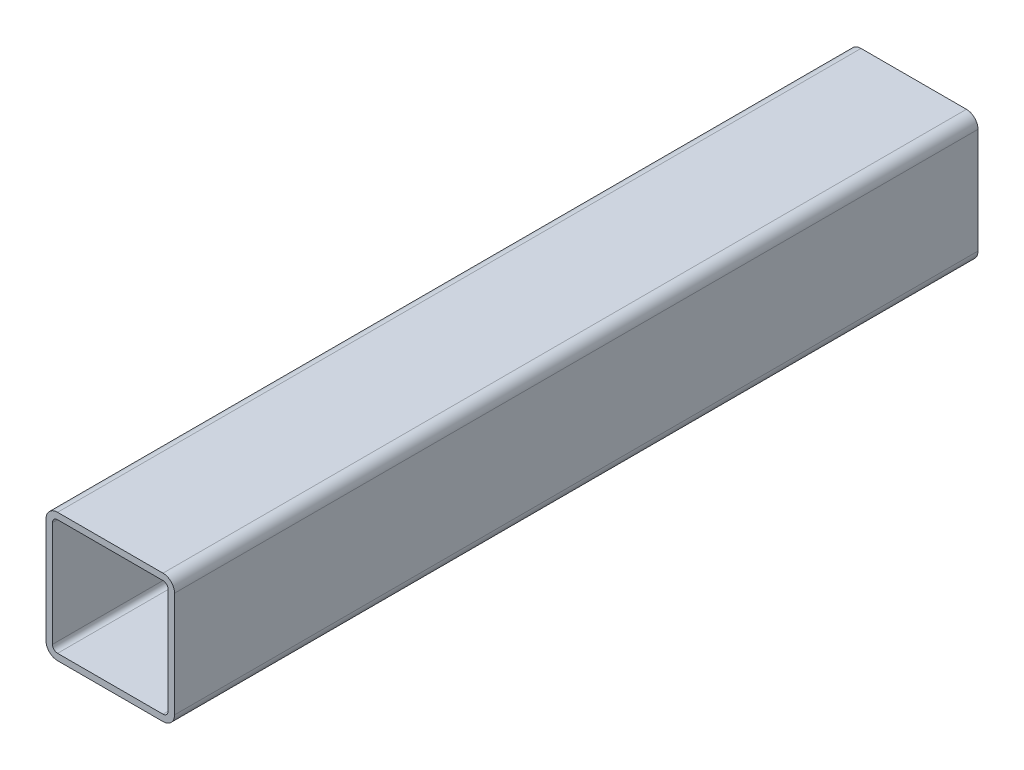
ISO-10303-21;
HEADER;
FILE_DESCRIPTION(('STEP AP214'),'2;1');
FILE_NAME('part.step','',(''),(''),'','','');
FILE_SCHEMA(('AUTOMOTIVE_DESIGN { 1 0 10303 214 1 1 1 1 }'));
ENDSEC;
DATA;
#1=APPLICATION_CONTEXT('core data for automotive mechanical design processes');
#2=APPLICATION_PROTOCOL_DEFINITION('international standard','automotive_design',2000,#1);
#3=PRODUCT_CONTEXT('',#1,'mechanical');
#4=PRODUCT('Part','Part','',(#3));
#5=PRODUCT_RELATED_PRODUCT_CATEGORY('part','',(#4));
#6=PRODUCT_DEFINITION_FORMATION('','',#4);
#7=PRODUCT_DEFINITION_CONTEXT('part definition',#1,'design');
#8=PRODUCT_DEFINITION('design','',#6,#7);
#9=PRODUCT_DEFINITION_SHAPE('','',#8);
#10=(LENGTH_UNIT() NAMED_UNIT(*) SI_UNIT(.MILLI.,.METRE.));
#11=(NAMED_UNIT(*) PLANE_ANGLE_UNIT() SI_UNIT($,.RADIAN.));
#12=(NAMED_UNIT(*) SI_UNIT($,.STERADIAN.) SOLID_ANGLE_UNIT());
#13=UNCERTAINTY_MEASURE_WITH_UNIT(LENGTH_MEASURE(1.E-05),#10,'distance_accuracy_value','');
#14=(GEOMETRIC_REPRESENTATION_CONTEXT(3) GLOBAL_UNCERTAINTY_ASSIGNED_CONTEXT((#13)) GLOBAL_UNIT_ASSIGNED_CONTEXT((#10,
#11,#12)) REPRESENTATION_CONTEXT('',''));
#15=CARTESIAN_POINT('',(0.,0.,0.));
#16=DIRECTION('',(0.,0.,1.));
#17=DIRECTION('',(1.,0.,0.));
#18=AXIS2_PLACEMENT_3D('',#15,#16,#17);
#19=CARTESIAN_POINT('',(32.8,32.8,500.));
#20=DIRECTION('',(0.,0.,1.));
#21=DIRECTION('',(1.,0.,0.));
#22=AXIS2_PLACEMENT_3D('',#19,#20,#21);
#23=PLANE('',#22);
#24=CARTESIAN_POINT('',(32.8,32.8,500.));
#25=DIRECTION('',(0.,0.,1.));
#26=DIRECTION('',(1.,0.,0.));
#27=AXIS2_PLACEMENT_3D('',#24,#25,#26);
#28=CIRCLE('',#27,7.20000000000001);
#29=CARTESIAN_POINT('',(40.,32.8,500.));
#30=VERTEX_POINT('',#29);
#31=CARTESIAN_POINT('',(32.8,40.,500.));
#32=VERTEX_POINT('',#31);
#33=EDGE_CURVE('E219',#30,#32,#28,.T.);
#34=ORIENTED_EDGE('',*,*,#33,.T.);
#35=DIRECTION('',(-1.,0.,0.));
#36=VECTOR('',#35,1.);
#37=CARTESIAN_POINT('',(32.8,40.,500.));
#38=LINE('',#37,#36);
#39=CARTESIAN_POINT('',(-32.8,40.,500.));
#40=VERTEX_POINT('',#39);
#41=EDGE_CURVE('E222',#32,#40,#38,.T.);
#42=ORIENTED_EDGE('',*,*,#41,.T.);
#43=CARTESIAN_POINT('',(-32.8,32.8,500.));
#44=DIRECTION('',(0.,0.,1.));
#45=DIRECTION('',(1.,0.,0.));
#46=AXIS2_PLACEMENT_3D('',#43,#44,#45);
#47=CIRCLE('',#46,7.20000000000001);
#48=CARTESIAN_POINT('',(-40.,32.8,500.));
#49=VERTEX_POINT('',#48);
#50=EDGE_CURVE('E225',#40,#49,#47,.T.);
#51=ORIENTED_EDGE('',*,*,#50,.T.);
#52=DIRECTION('',(0.,-1.,0.));
#53=VECTOR('',#52,1.);
#54=CARTESIAN_POINT('',(-40.,-32.8,500.));
#55=LINE('',#54,#53);
#56=CARTESIAN_POINT('',(-40.,-32.8,500.));
#57=VERTEX_POINT('',#56);
#58=EDGE_CURVE('E227',#49,#57,#55,.T.);
#59=ORIENTED_EDGE('',*,*,#58,.T.);
#60=CARTESIAN_POINT('',(-32.8,-32.8,500.));
#61=DIRECTION('',(0.,0.,1.));
#62=DIRECTION('',(1.,0.,0.));
#63=AXIS2_PLACEMENT_3D('',#60,#61,#62);
#64=CIRCLE('',#63,7.2);
#65=CARTESIAN_POINT('',(-32.8,-40.,500.));
#66=VERTEX_POINT('',#65);
#67=EDGE_CURVE('E229',#57,#66,#64,.T.);
#68=ORIENTED_EDGE('',*,*,#67,.T.);
#69=DIRECTION('',(1.,0.,0.));
#70=VECTOR('',#69,1.);
#71=CARTESIAN_POINT('',(-32.8,-40.,500.));
#72=LINE('',#71,#70);
#73=CARTESIAN_POINT('',(32.8,-40.,500.));
#74=VERTEX_POINT('',#73);
#75=EDGE_CURVE('E231',#66,#74,#72,.T.);
#76=ORIENTED_EDGE('',*,*,#75,.T.);
#77=CARTESIAN_POINT('',(32.8,-32.8,500.));
#78=DIRECTION('',(0.,0.,1.));
#79=DIRECTION('',(1.,0.,0.));
#80=AXIS2_PLACEMENT_3D('',#77,#78,#79);
#81=CIRCLE('',#80,7.20000000000001);
#82=CARTESIAN_POINT('',(40.,-32.8,500.));
#83=VERTEX_POINT('',#82);
#84=EDGE_CURVE('E233',#74,#83,#81,.T.);
#85=ORIENTED_EDGE('',*,*,#84,.T.);
#86=DIRECTION('',(0.,1.,0.));
#87=VECTOR('',#86,1.);
#88=CARTESIAN_POINT('',(40.,32.8,500.));
#89=LINE('',#88,#87);
#90=EDGE_CURVE('E235',#83,#30,#89,.T.);
#91=ORIENTED_EDGE('',*,*,#90,.T.);
#92=EDGE_LOOP('',(#34,#42,#51,#59,#68,#76,#85,#91));
#93=FACE_BOUND('',#92,.T.);
#94=DIRECTION('',(0.,-1.,0.));
#95=VECTOR('',#94,1.);
#96=CARTESIAN_POINT('',(-36.,-32.8,500.));
#97=LINE('',#96,#95);
#98=CARTESIAN_POINT('',(-36.,32.8,500.));
#99=VERTEX_POINT('',#98);
#100=CARTESIAN_POINT('',(-36.,-32.8,500.));
#101=VERTEX_POINT('',#100);
#102=EDGE_CURVE('E162',#99,#101,#97,.T.);
#103=ORIENTED_EDGE('',*,*,#102,.F.);
#104=CARTESIAN_POINT('',(-32.8,32.8,500.));
#105=DIRECTION('',(0.,0.,1.));
#106=DIRECTION('',(1.,0.,0.));
#107=AXIS2_PLACEMENT_3D('',#104,#105,#106);
#108=CIRCLE('',#107,3.20000000000001);
#109=CARTESIAN_POINT('',(-32.8,36.,500.));
#110=VERTEX_POINT('',#109);
#111=EDGE_CURVE('E154',#110,#99,#108,.T.);
#112=ORIENTED_EDGE('',*,*,#111,.F.);
#113=DIRECTION('',(-1.,0.,0.));
#114=VECTOR('',#113,1.);
#115=CARTESIAN_POINT('',(32.8,36.,500.));
#116=LINE('',#115,#114);
#117=CARTESIAN_POINT('',(32.8,36.,500.));
#118=VERTEX_POINT('',#117);
#119=EDGE_CURVE('E187',#118,#110,#116,.T.);
#120=ORIENTED_EDGE('',*,*,#119,.F.);
#121=CARTESIAN_POINT('',(32.8,32.8,500.));
#122=DIRECTION('',(0.,0.,1.));
#123=DIRECTION('',(1.,0.,0.));
#124=AXIS2_PLACEMENT_3D('',#121,#122,#123);
#125=CIRCLE('',#124,3.20000000000001);
#126=CARTESIAN_POINT('',(36.,32.8,500.));
#127=VERTEX_POINT('',#126);
#128=EDGE_CURVE('E185',#127,#118,#125,.T.);
#129=ORIENTED_EDGE('',*,*,#128,.F.);
#130=DIRECTION('',(0.,1.,0.));
#131=VECTOR('',#130,1.);
#132=CARTESIAN_POINT('',(36.,32.8,500.));
#133=LINE('',#132,#131);
#134=CARTESIAN_POINT('',(36.,-32.8,500.));
#135=VERTEX_POINT('',#134);
#136=EDGE_CURVE('E183',#135,#127,#133,.T.);
#137=ORIENTED_EDGE('',*,*,#136,.F.);
#138=CARTESIAN_POINT('',(32.8,-32.8,500.));
#139=DIRECTION('',(0.,0.,1.));
#140=DIRECTION('',(1.,0.,0.));
#141=AXIS2_PLACEMENT_3D('',#138,#139,#140);
#142=CIRCLE('',#141,3.20000000000001);
#143=CARTESIAN_POINT('',(32.8,-36.,500.));
#144=VERTEX_POINT('',#143);
#145=EDGE_CURVE('E181',#144,#135,#142,.T.);
#146=ORIENTED_EDGE('',*,*,#145,.F.);
#147=DIRECTION('',(1.,0.,0.));
#148=VECTOR('',#147,1.);
#149=CARTESIAN_POINT('',(-32.8,-36.,500.));
#150=LINE('',#149,#148);
#151=CARTESIAN_POINT('',(-32.8,-36.,500.));
#152=VERTEX_POINT('',#151);
#153=EDGE_CURVE('E177',#152,#144,#150,.T.);
#154=ORIENTED_EDGE('',*,*,#153,.F.);
#155=CARTESIAN_POINT('',(-32.8,-32.8,500.));
#156=DIRECTION('',(0.,0.,1.));
#157=DIRECTION('',(1.,0.,0.));
#158=AXIS2_PLACEMENT_3D('',#155,#156,#157);
#159=CIRCLE('',#158,3.20000000000001);
#160=EDGE_CURVE('E175',#101,#152,#159,.T.);
#161=ORIENTED_EDGE('',*,*,#160,.F.);
#162=EDGE_LOOP('',(#103,#112,#120,#129,#137,#146,#154,#161));
#163=FACE_BOUND('',#162,.T.);
#164=ADVANCED_FACE('F41',(#93,#163),#23,.T.);
#165=CARTESIAN_POINT('',(32.8,32.8,0.));
#166=DIRECTION('',(0.,0.,1.));
#167=DIRECTION('',(1.,0.,0.));
#168=AXIS2_PLACEMENT_3D('',#165,#166,#167);
#169=PLANE('',#168);
#170=CARTESIAN_POINT('',(32.8,32.8,0.));
#171=DIRECTION('',(0.,0.,1.));
#172=DIRECTION('',(1.,0.,0.));
#173=AXIS2_PLACEMENT_3D('',#170,#171,#172);
#174=CIRCLE('',#173,7.20000000000001);
#175=CARTESIAN_POINT('',(40.,32.8,0.));
#176=VERTEX_POINT('',#175);
#177=CARTESIAN_POINT('',(32.8,40.,0.));
#178=VERTEX_POINT('',#177);
#179=EDGE_CURVE('E170',#176,#178,#174,.T.);
#180=ORIENTED_EDGE('',*,*,#179,.F.);
#181=DIRECTION('',(0.,1.,0.));
#182=VECTOR('',#181,1.);
#183=CARTESIAN_POINT('',(40.,32.8,0.));
#184=LINE('',#183,#182);
#185=CARTESIAN_POINT('',(40.,-32.8,0.));
#186=VERTEX_POINT('',#185);
#187=EDGE_CURVE('E223',#186,#176,#184,.T.);
#188=ORIENTED_EDGE('',*,*,#187,.F.);
#189=CARTESIAN_POINT('',(32.8,-32.8,0.));
#190=DIRECTION('',(0.,0.,1.));
#191=DIRECTION('',(1.,0.,0.));
#192=AXIS2_PLACEMENT_3D('',#189,#190,#191);
#193=CIRCLE('',#192,7.20000000000001);
#194=CARTESIAN_POINT('',(32.8,-40.,0.));
#195=VERTEX_POINT('',#194);
#196=EDGE_CURVE('E250',#195,#186,#193,.T.);
#197=ORIENTED_EDGE('',*,*,#196,.F.);
#198=DIRECTION('',(1.,0.,0.));
#199=VECTOR('',#198,1.);
#200=CARTESIAN_POINT('',(-32.8,-40.,0.));
#201=LINE('',#200,#199);
#202=CARTESIAN_POINT('',(-32.8,-40.,0.));
#203=VERTEX_POINT('',#202);
#204=EDGE_CURVE('E248',#203,#195,#201,.T.);
#205=ORIENTED_EDGE('',*,*,#204,.F.);
#206=CARTESIAN_POINT('',(-32.8,-32.8,0.));
#207=DIRECTION('',(0.,0.,1.));
#208=DIRECTION('',(1.,0.,0.));
#209=AXIS2_PLACEMENT_3D('',#206,#207,#208);
#210=CIRCLE('',#209,7.2);
#211=CARTESIAN_POINT('',(-40.,-32.8,0.));
#212=VERTEX_POINT('',#211);
#213=EDGE_CURVE('E246',#212,#203,#210,.T.);
#214=ORIENTED_EDGE('',*,*,#213,.F.);
#215=DIRECTION('',(0.,-1.,0.));
#216=VECTOR('',#215,1.);
#217=CARTESIAN_POINT('',(-40.,-32.8,0.));
#218=LINE('',#217,#216);
#219=CARTESIAN_POINT('',(-40.,32.8,0.));
#220=VERTEX_POINT('',#219);
#221=EDGE_CURVE('E244',#220,#212,#218,.T.);
#222=ORIENTED_EDGE('',*,*,#221,.F.);
#223=CARTESIAN_POINT('',(-32.8,32.8,0.));
#224=DIRECTION('',(0.,0.,1.));
#225=DIRECTION('',(1.,0.,0.));
#226=AXIS2_PLACEMENT_3D('',#223,#224,#225);
#227=CIRCLE('',#226,7.20000000000001);
#228=CARTESIAN_POINT('',(-32.8,40.,0.));
#229=VERTEX_POINT('',#228);
#230=EDGE_CURVE('E242',#229,#220,#227,.T.);
#231=ORIENTED_EDGE('',*,*,#230,.F.);
#232=DIRECTION('',(-1.,0.,0.));
#233=VECTOR('',#232,1.);
#234=CARTESIAN_POINT('',(32.8,40.,0.));
#235=LINE('',#234,#233);
#236=EDGE_CURVE('E240',#178,#229,#235,.T.);
#237=ORIENTED_EDGE('',*,*,#236,.F.);
#238=EDGE_LOOP('',(#180,#188,#197,#205,#214,#222,#231,#237));
#239=FACE_BOUND('',#238,.T.);
#240=CARTESIAN_POINT('',(-32.8,32.8,0.));
#241=DIRECTION('',(0.,0.,1.));
#242=DIRECTION('',(1.,0.,0.));
#243=AXIS2_PLACEMENT_3D('',#240,#241,#242);
#244=CIRCLE('',#243,3.20000000000001);
#245=CARTESIAN_POINT('',(-32.8,36.,0.));
#246=VERTEX_POINT('',#245);
#247=CARTESIAN_POINT('',(-36.,32.8,0.));
#248=VERTEX_POINT('',#247);
#249=EDGE_CURVE('E64',#246,#248,#244,.T.);
#250=ORIENTED_EDGE('',*,*,#249,.T.);
#251=DIRECTION('',(0.,-1.,0.));
#252=VECTOR('',#251,1.);
#253=CARTESIAN_POINT('',(-36.,-32.8,0.));
#254=LINE('',#253,#252);
#255=CARTESIAN_POINT('',(-36.,-32.8,0.));
#256=VERTEX_POINT('',#255);
#257=EDGE_CURVE('E169',#248,#256,#254,.T.);
#258=ORIENTED_EDGE('',*,*,#257,.T.);
#259=CARTESIAN_POINT('',(-32.8,-32.8,0.));
#260=DIRECTION('',(0.,0.,1.));
#261=DIRECTION('',(1.,0.,0.));
#262=AXIS2_PLACEMENT_3D('',#259,#260,#261);
#263=CIRCLE('',#262,3.20000000000001);
#264=CARTESIAN_POINT('',(-32.8,-36.,0.));
#265=VERTEX_POINT('',#264);
#266=EDGE_CURVE('E191',#256,#265,#263,.T.);
#267=ORIENTED_EDGE('',*,*,#266,.T.);
#268=DIRECTION('',(1.,0.,0.));
#269=VECTOR('',#268,1.);
#270=CARTESIAN_POINT('',(-32.8,-36.,0.));
#271=LINE('',#270,#269);
#272=CARTESIAN_POINT('',(32.8,-36.,0.));
#273=VERTEX_POINT('',#272);
#274=EDGE_CURVE('E194',#265,#273,#271,.T.);
#275=ORIENTED_EDGE('',*,*,#274,.T.);
#276=CARTESIAN_POINT('',(32.8,-32.8,0.));
#277=DIRECTION('',(0.,0.,1.));
#278=DIRECTION('',(1.,0.,0.));
#279=AXIS2_PLACEMENT_3D('',#276,#277,#278);
#280=CIRCLE('',#279,3.20000000000001);
#281=CARTESIAN_POINT('',(36.,-32.8,0.));
#282=VERTEX_POINT('',#281);
#283=EDGE_CURVE('E197',#273,#282,#280,.T.);
#284=ORIENTED_EDGE('',*,*,#283,.T.);
#285=DIRECTION('',(0.,1.,0.));
#286=VECTOR('',#285,1.);
#287=CARTESIAN_POINT('',(36.,32.8,0.));
#288=LINE('',#287,#286);
#289=CARTESIAN_POINT('',(36.,32.8,0.));
#290=VERTEX_POINT('',#289);
#291=EDGE_CURVE('E200',#282,#290,#288,.T.);
#292=ORIENTED_EDGE('',*,*,#291,.T.);
#293=CARTESIAN_POINT('',(32.8,32.8,0.));
#294=DIRECTION('',(0.,0.,1.));
#295=DIRECTION('',(1.,0.,0.));
#296=AXIS2_PLACEMENT_3D('',#293,#294,#295);
#297=CIRCLE('',#296,3.20000000000001);
#298=CARTESIAN_POINT('',(32.8,36.,0.));
#299=VERTEX_POINT('',#298);
#300=EDGE_CURVE('E203',#290,#299,#297,.T.);
#301=ORIENTED_EDGE('',*,*,#300,.T.);
#302=DIRECTION('',(-1.,0.,0.));
#303=VECTOR('',#302,1.);
#304=CARTESIAN_POINT('',(32.8,36.,0.));
#305=LINE('',#304,#303);
#306=EDGE_CURVE('E163',#299,#246,#305,.T.);
#307=ORIENTED_EDGE('',*,*,#306,.T.);
#308=EDGE_LOOP('',(#250,#258,#267,#275,#284,#292,#301,#307));
#309=FACE_BOUND('',#308,.T.);
#310=ADVANCED_FACE('F280',(#239,#309),#169,.F.);
#311=CARTESIAN_POINT('',(32.8,32.8,500.));
#312=DIRECTION('',(0.,0.,-1.));
#313=DIRECTION('',(-1.,0.,0.));
#314=AXIS2_PLACEMENT_3D('',#311,#312,#313);
#315=CYLINDRICAL_SURFACE('',#314,7.20000000000001);
#316=ORIENTED_EDGE('',*,*,#179,.T.);
#317=DIRECTION('',(0.,0.,-1.));
#318=VECTOR('',#317,1.);
#319=CARTESIAN_POINT('',(32.8,40.,500.));
#320=LINE('',#319,#318);
#321=EDGE_CURVE('E11',#32,#178,#320,.T.);
#322=ORIENTED_EDGE('',*,*,#321,.F.);
#323=ORIENTED_EDGE('',*,*,#33,.F.);
#324=DIRECTION('',(0.,0.,-1.));
#325=VECTOR('',#324,1.);
#326=CARTESIAN_POINT('',(40.,32.8,500.));
#327=LINE('',#326,#325);
#328=EDGE_CURVE('E237',#30,#176,#327,.T.);
#329=ORIENTED_EDGE('',*,*,#328,.T.);
#330=EDGE_LOOP('',(#316,#322,#323,#329));
#331=FACE_BOUND('',#330,.T.);
#332=ADVANCED_FACE('F43',(#331),#315,.T.);
#333=CARTESIAN_POINT('',(32.8,40.,500.));
#334=DIRECTION('',(0.,-1.,0.));
#335=DIRECTION('',(0.,0.,-1.));
#336=AXIS2_PLACEMENT_3D('',#333,#334,#335);
#337=PLANE('',#336);
#338=ORIENTED_EDGE('',*,*,#236,.T.);
#339=DIRECTION('',(0.,0.,-1.));
#340=VECTOR('',#339,1.);
#341=CARTESIAN_POINT('',(-32.8,40.,500.));
#342=LINE('',#341,#340);
#343=EDGE_CURVE('E49',#40,#229,#342,.T.);
#344=ORIENTED_EDGE('',*,*,#343,.F.);
#345=ORIENTED_EDGE('',*,*,#41,.F.);
#346=ORIENTED_EDGE('',*,*,#321,.T.);
#347=EDGE_LOOP('',(#338,#344,#345,#346));
#348=FACE_BOUND('',#347,.T.);
#349=ADVANCED_FACE('F297',(#348),#337,.F.);
#350=CARTESIAN_POINT('',(-32.8,32.8,500.));
#351=DIRECTION('',(0.,0.,-1.));
#352=DIRECTION('',(-1.,0.,0.));
#353=AXIS2_PLACEMENT_3D('',#350,#351,#352);
#354=CYLINDRICAL_SURFACE('',#353,7.20000000000001);
#355=ORIENTED_EDGE('',*,*,#230,.T.);
#356=DIRECTION('',(0.,0.,-1.));
#357=VECTOR('',#356,1.);
#358=CARTESIAN_POINT('',(-40.,32.8,500.));
#359=LINE('',#358,#357);
#360=EDGE_CURVE('E267',#49,#220,#359,.T.);
#361=ORIENTED_EDGE('',*,*,#360,.F.);
#362=ORIENTED_EDGE('',*,*,#50,.F.);
#363=ORIENTED_EDGE('',*,*,#343,.T.);
#364=EDGE_LOOP('',(#355,#361,#362,#363));
#365=FACE_BOUND('',#364,.T.);
#366=ADVANCED_FACE('F274',(#365),#354,.T.);
#367=CARTESIAN_POINT('',(-40.,-32.8,500.));
#368=DIRECTION('',(1.,0.,0.));
#369=DIRECTION('',(0.,0.,-1.));
#370=AXIS2_PLACEMENT_3D('',#367,#368,#369);
#371=PLANE('',#370);
#372=ORIENTED_EDGE('',*,*,#221,.T.);
#373=DIRECTION('',(0.,0.,-1.));
#374=VECTOR('',#373,1.);
#375=CARTESIAN_POINT('',(-40.,-32.8,500.));
#376=LINE('',#375,#374);
#377=EDGE_CURVE('E264',#57,#212,#376,.T.);
#378=ORIENTED_EDGE('',*,*,#377,.F.);
#379=ORIENTED_EDGE('',*,*,#58,.F.);
#380=ORIENTED_EDGE('',*,*,#360,.T.);
#381=EDGE_LOOP('',(#372,#378,#379,#380));
#382=FACE_BOUND('',#381,.T.);
#383=ADVANCED_FACE('F286',(#382),#371,.F.);
#384=CARTESIAN_POINT('',(-32.8,-32.8,500.));
#385=DIRECTION('',(0.,0.,-1.));
#386=DIRECTION('',(-1.,0.,0.));
#387=AXIS2_PLACEMENT_3D('',#384,#385,#386);
#388=CYLINDRICAL_SURFACE('',#387,7.2);
#389=ORIENTED_EDGE('',*,*,#213,.T.);
#390=DIRECTION('',(0.,0.,-1.));
#391=VECTOR('',#390,1.);
#392=CARTESIAN_POINT('',(-32.8,-40.,500.));
#393=LINE('',#392,#391);
#394=EDGE_CURVE('E261',#66,#203,#393,.T.);
#395=ORIENTED_EDGE('',*,*,#394,.F.);
#396=ORIENTED_EDGE('',*,*,#67,.F.);
#397=ORIENTED_EDGE('',*,*,#377,.T.);
#398=EDGE_LOOP('',(#389,#395,#396,#397));
#399=FACE_BOUND('',#398,.T.);
#400=ADVANCED_FACE('F290',(#399),#388,.T.);
#401=CARTESIAN_POINT('',(-32.8,-40.,500.));
#402=DIRECTION('',(0.,1.,0.));
#403=DIRECTION('',(0.,0.,1.));
#404=AXIS2_PLACEMENT_3D('',#401,#402,#403);
#405=PLANE('',#404);
#406=ORIENTED_EDGE('',*,*,#204,.T.);
#407=DIRECTION('',(0.,0.,-1.));
#408=VECTOR('',#407,1.);
#409=CARTESIAN_POINT('',(32.8,-40.,500.));
#410=LINE('',#409,#408);
#411=EDGE_CURVE('E258',#74,#195,#410,.T.);
#412=ORIENTED_EDGE('',*,*,#411,.F.);
#413=ORIENTED_EDGE('',*,*,#75,.F.);
#414=ORIENTED_EDGE('',*,*,#394,.T.);
#415=EDGE_LOOP('',(#406,#412,#413,#414));
#416=FACE_BOUND('',#415,.T.);
#417=ADVANCED_FACE('F310',(#416),#405,.F.);
#418=CARTESIAN_POINT('',(32.8,-32.8,500.));
#419=DIRECTION('',(0.,0.,-1.));
#420=DIRECTION('',(-1.,0.,0.));
#421=AXIS2_PLACEMENT_3D('',#418,#419,#420);
#422=CYLINDRICAL_SURFACE('',#421,7.20000000000001);
#423=ORIENTED_EDGE('',*,*,#196,.T.);
#424=DIRECTION('',(0.,0.,-1.));
#425=VECTOR('',#424,1.);
#426=CARTESIAN_POINT('',(40.,-32.8,500.));
#427=LINE('',#426,#425);
#428=EDGE_CURVE('E255',#83,#186,#427,.T.);
#429=ORIENTED_EDGE('',*,*,#428,.F.);
#430=ORIENTED_EDGE('',*,*,#84,.F.);
#431=ORIENTED_EDGE('',*,*,#411,.T.);
#432=EDGE_LOOP('',(#423,#429,#430,#431));
#433=FACE_BOUND('',#432,.T.);
#434=ADVANCED_FACE('F308',(#433),#422,.T.);
#435=CARTESIAN_POINT('',(40.,32.8,500.));
#436=DIRECTION('',(-1.,0.,0.));
#437=DIRECTION('',(0.,0.,1.));
#438=AXIS2_PLACEMENT_3D('',#435,#436,#437);
#439=PLANE('',#438);
#440=ORIENTED_EDGE('',*,*,#187,.T.);
#441=ORIENTED_EDGE('',*,*,#328,.F.);
#442=ORIENTED_EDGE('',*,*,#90,.F.);
#443=ORIENTED_EDGE('',*,*,#428,.T.);
#444=EDGE_LOOP('',(#440,#441,#442,#443));
#445=FACE_BOUND('',#444,.T.);
#446=ADVANCED_FACE('F303',(#445),#439,.F.);
#447=CARTESIAN_POINT('',(-32.8,32.8,500.));
#448=DIRECTION('',(0.,0.,-1.));
#449=DIRECTION('',(-1.,0.,0.));
#450=AXIS2_PLACEMENT_3D('',#447,#448,#449);
#451=CYLINDRICAL_SURFACE('',#450,3.20000000000001);
#452=ORIENTED_EDGE('',*,*,#249,.F.);
#453=DIRECTION('',(0.,0.,-1.));
#454=VECTOR('',#453,1.);
#455=CARTESIAN_POINT('',(-32.8,36.,500.));
#456=LINE('',#455,#454);
#457=EDGE_CURVE('E158',#110,#246,#456,.T.);
#458=ORIENTED_EDGE('',*,*,#457,.F.);
#459=ORIENTED_EDGE('',*,*,#111,.T.);
#460=DIRECTION('',(0.,0.,-1.));
#461=VECTOR('',#460,1.);
#462=CARTESIAN_POINT('',(-36.,32.8,500.));
#463=LINE('',#462,#461);
#464=EDGE_CURVE('E157',#99,#248,#463,.T.);
#465=ORIENTED_EDGE('',*,*,#464,.T.);
#466=EDGE_LOOP('',(#452,#458,#459,#465));
#467=FACE_BOUND('',#466,.T.);
#468=ADVANCED_FACE('F156',(#467),#451,.F.);
#469=CARTESIAN_POINT('',(-36.,-32.8,500.));
#470=DIRECTION('',(1.,0.,0.));
#471=DIRECTION('',(0.,0.,-1.));
#472=AXIS2_PLACEMENT_3D('',#469,#470,#471);
#473=PLANE('',#472);
#474=ORIENTED_EDGE('',*,*,#257,.F.);
#475=ORIENTED_EDGE('',*,*,#464,.F.);
#476=ORIENTED_EDGE('',*,*,#102,.T.);
#477=DIRECTION('',(0.,0.,-1.));
#478=VECTOR('',#477,1.);
#479=CARTESIAN_POINT('',(-36.,-32.8,500.));
#480=LINE('',#479,#478);
#481=EDGE_CURVE('E171',#101,#256,#480,.T.);
#482=ORIENTED_EDGE('',*,*,#481,.T.);
#483=EDGE_LOOP('',(#474,#475,#476,#482));
#484=FACE_BOUND('',#483,.T.);
#485=ADVANCED_FACE('F166',(#484),#473,.T.);
#486=CARTESIAN_POINT('',(-32.8,-32.8,500.));
#487=DIRECTION('',(0.,0.,-1.));
#488=DIRECTION('',(-1.,0.,0.));
#489=AXIS2_PLACEMENT_3D('',#486,#487,#488);
#490=CYLINDRICAL_SURFACE('',#489,3.20000000000001);
#491=ORIENTED_EDGE('',*,*,#266,.F.);
#492=ORIENTED_EDGE('',*,*,#481,.F.);
#493=ORIENTED_EDGE('',*,*,#160,.T.);
#494=DIRECTION('',(0.,0.,-1.));
#495=VECTOR('',#494,1.);
#496=CARTESIAN_POINT('',(-32.8,-36.,500.));
#497=LINE('',#496,#495);
#498=EDGE_CURVE('E216',#152,#265,#497,.T.);
#499=ORIENTED_EDGE('',*,*,#498,.T.);
#500=EDGE_LOOP('',(#491,#492,#493,#499));
#501=FACE_BOUND('',#500,.T.);
#502=ADVANCED_FACE('F335',(#501),#490,.F.);
#503=CARTESIAN_POINT('',(-32.8,-36.,500.));
#504=DIRECTION('',(0.,1.,0.));
#505=DIRECTION('',(0.,0.,1.));
#506=AXIS2_PLACEMENT_3D('',#503,#504,#505);
#507=PLANE('',#506);
#508=ORIENTED_EDGE('',*,*,#274,.F.);
#509=ORIENTED_EDGE('',*,*,#498,.F.);
#510=ORIENTED_EDGE('',*,*,#153,.T.);
#511=DIRECTION('',(0.,0.,-1.));
#512=VECTOR('',#511,1.);
#513=CARTESIAN_POINT('',(32.8,-36.,500.));
#514=LINE('',#513,#512);
#515=EDGE_CURVE('E214',#144,#273,#514,.T.);
#516=ORIENTED_EDGE('',*,*,#515,.T.);
#517=EDGE_LOOP('',(#508,#509,#510,#516));
#518=FACE_BOUND('',#517,.T.);
#519=ADVANCED_FACE('F339',(#518),#507,.T.);
#520=CARTESIAN_POINT('',(32.8,-32.8,500.));
#521=DIRECTION('',(0.,0.,-1.));
#522=DIRECTION('',(-1.,0.,0.));
#523=AXIS2_PLACEMENT_3D('',#520,#521,#522);
#524=CYLINDRICAL_SURFACE('',#523,3.20000000000001);
#525=ORIENTED_EDGE('',*,*,#283,.F.);
#526=ORIENTED_EDGE('',*,*,#515,.F.);
#527=ORIENTED_EDGE('',*,*,#145,.T.);
#528=DIRECTION('',(0.,0.,-1.));
#529=VECTOR('',#528,1.);
#530=CARTESIAN_POINT('',(36.,-32.8,500.));
#531=LINE('',#530,#529);
#532=EDGE_CURVE('E212',#135,#282,#531,.T.);
#533=ORIENTED_EDGE('',*,*,#532,.T.);
#534=EDGE_LOOP('',(#525,#526,#527,#533));
#535=FACE_BOUND('',#534,.T.);
#536=ADVANCED_FACE('F345',(#535),#524,.F.);
#537=CARTESIAN_POINT('',(36.,32.8,500.));
#538=DIRECTION('',(-1.,0.,0.));
#539=DIRECTION('',(0.,0.,1.));
#540=AXIS2_PLACEMENT_3D('',#537,#538,#539);
#541=PLANE('',#540);
#542=ORIENTED_EDGE('',*,*,#291,.F.);
#543=ORIENTED_EDGE('',*,*,#532,.F.);
#544=ORIENTED_EDGE('',*,*,#136,.T.);
#545=DIRECTION('',(0.,0.,-1.));
#546=VECTOR('',#545,1.);
#547=CARTESIAN_POINT('',(36.,32.8,500.));
#548=LINE('',#547,#546);
#549=EDGE_CURVE('E210',#127,#290,#548,.T.);
#550=ORIENTED_EDGE('',*,*,#549,.T.);
#551=EDGE_LOOP('',(#542,#543,#544,#550));
#552=FACE_BOUND('',#551,.T.);
#553=ADVANCED_FACE('F349',(#552),#541,.T.);
#554=CARTESIAN_POINT('',(32.8,32.8,500.));
#555=DIRECTION('',(0.,0.,-1.));
#556=DIRECTION('',(-1.,0.,0.));
#557=AXIS2_PLACEMENT_3D('',#554,#555,#556);
#558=CYLINDRICAL_SURFACE('',#557,3.20000000000001);
#559=ORIENTED_EDGE('',*,*,#300,.F.);
#560=ORIENTED_EDGE('',*,*,#549,.F.);
#561=ORIENTED_EDGE('',*,*,#128,.T.);
#562=DIRECTION('',(0.,0.,-1.));
#563=VECTOR('',#562,1.);
#564=CARTESIAN_POINT('',(32.8,36.,500.));
#565=LINE('',#564,#563);
#566=EDGE_CURVE('E56',#118,#299,#565,.T.);
#567=ORIENTED_EDGE('',*,*,#566,.T.);
#568=EDGE_LOOP('',(#559,#560,#561,#567));
#569=FACE_BOUND('',#568,.T.);
#570=ADVANCED_FACE('F353',(#569),#558,.F.);
#571=CARTESIAN_POINT('',(32.8,36.,500.));
#572=DIRECTION('',(0.,-1.,0.));
#573=DIRECTION('',(0.,0.,-1.));
#574=AXIS2_PLACEMENT_3D('',#571,#572,#573);
#575=PLANE('',#574);
#576=ORIENTED_EDGE('',*,*,#306,.F.);
#577=ORIENTED_EDGE('',*,*,#566,.F.);
#578=ORIENTED_EDGE('',*,*,#119,.T.);
#579=ORIENTED_EDGE('',*,*,#457,.T.);
#580=EDGE_LOOP('',(#576,#577,#578,#579));
#581=FACE_BOUND('',#580,.T.);
#582=ADVANCED_FACE('F357',(#581),#575,.T.);
#583=CLOSED_SHELL('',(#164,#310,#332,#349,#366,#383,#400,#417,#434,#446,#468,#485,#502,#519,
#536,#553,#570,#582));
#584=MANIFOLD_SOLID_BREP('B2',#583);
#585=ADVANCED_BREP_SHAPE_REPRESENTATION('',(#18,#584),#14);
#586=SHAPE_DEFINITION_REPRESENTATION(#9,#585);
ENDSEC;
END-ISO-10303-21;
